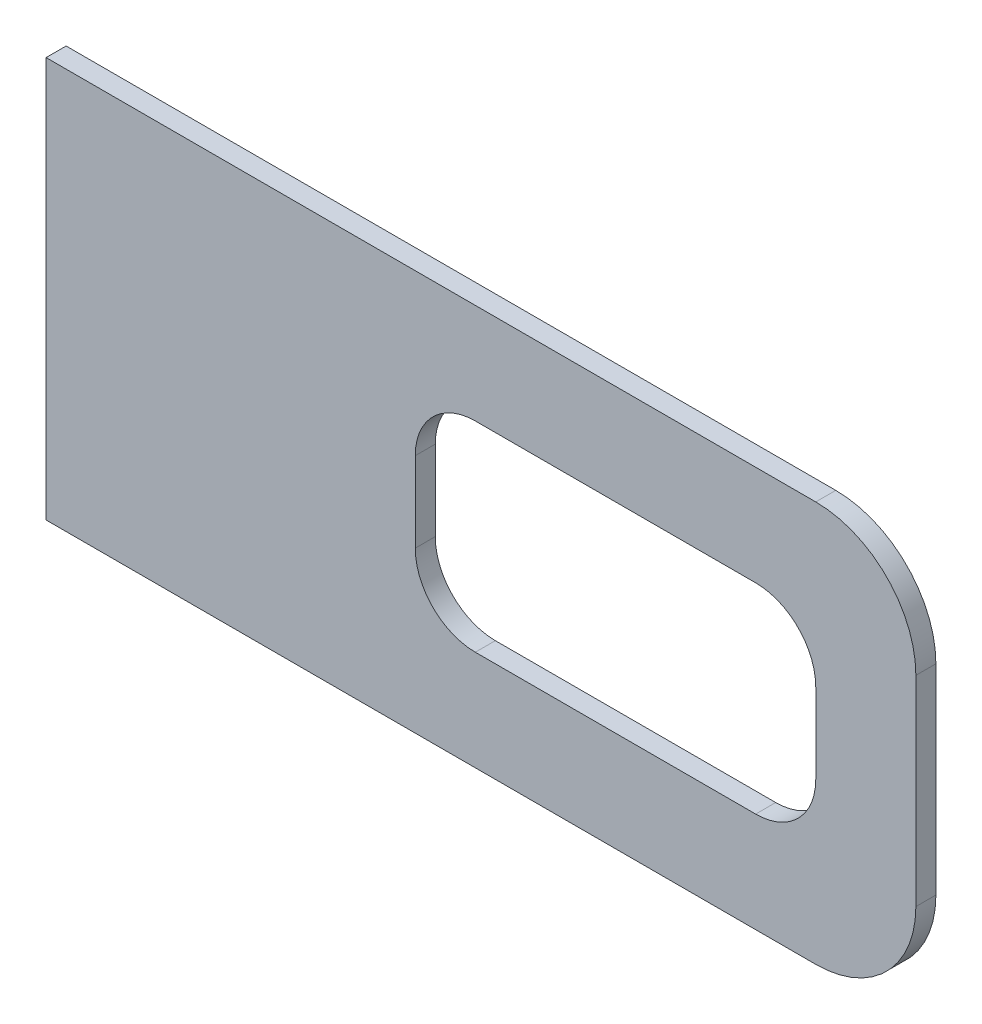
ISO-10303-21;
HEADER;
FILE_DESCRIPTION(('STEP AP214'),'2;1');
FILE_NAME('part.step','',(''),(''),'','','');
FILE_SCHEMA(('AUTOMOTIVE_DESIGN { 1 0 10303 214 1 1 1 1 }'));
ENDSEC;
DATA;
#1=APPLICATION_CONTEXT('core data for automotive mechanical design processes');
#2=APPLICATION_PROTOCOL_DEFINITION('international standard','automotive_design',2000,#1);
#3=PRODUCT_CONTEXT('',#1,'mechanical');
#4=PRODUCT('Part','Part','',(#3));
#5=PRODUCT_RELATED_PRODUCT_CATEGORY('part','',(#4));
#6=PRODUCT_DEFINITION_FORMATION('','',#4);
#7=PRODUCT_DEFINITION_CONTEXT('part definition',#1,'design');
#8=PRODUCT_DEFINITION('design','',#6,#7);
#9=PRODUCT_DEFINITION_SHAPE('','',#8);
#10=(LENGTH_UNIT() NAMED_UNIT(*) SI_UNIT(.MILLI.,.METRE.));
#11=(NAMED_UNIT(*) PLANE_ANGLE_UNIT() SI_UNIT($,.RADIAN.));
#12=(NAMED_UNIT(*) SI_UNIT($,.STERADIAN.) SOLID_ANGLE_UNIT());
#13=UNCERTAINTY_MEASURE_WITH_UNIT(LENGTH_MEASURE(1.E-05),#10,'distance_accuracy_value','');
#14=(GEOMETRIC_REPRESENTATION_CONTEXT(3) GLOBAL_UNCERTAINTY_ASSIGNED_CONTEXT((#13)) GLOBAL_UNIT_ASSIGNED_CONTEXT((#10,
#11,#12)) REPRESENTATION_CONTEXT('',''));
#15=CARTESIAN_POINT('',(0.,0.,0.));
#16=DIRECTION('',(0.,0.,1.));
#17=DIRECTION('',(1.,0.,0.));
#18=AXIS2_PLACEMENT_3D('',#15,#16,#17);
#19=CARTESIAN_POINT('',(5.82825052987823,-48.3092027669727,-17.95));
#20=DIRECTION('',(0.,0.,-1.));
#21=DIRECTION('',(-1.,0.,0.));
#22=AXIS2_PLACEMENT_3D('',#19,#20,#21);
#23=PLANE('',#22);
#24=DIRECTION('',(-1.,0.,0.));
#25=VECTOR('',#24,1.);
#26=CARTESIAN_POINT('',(5.04569769900331,-49.4500000000233,-17.95));
#27=LINE('',#26,#25);
#28=CARTESIAN_POINT('',(3.65650105975645,-49.4500000000274,-17.95));
#29=VERTEX_POINT('',#28);
#30=CARTESIAN_POINT('',(7.5,-49.4500000000233,-17.95));
#31=VERTEX_POINT('',#30);
#32=EDGE_CURVE('E133',#29,#31,#27,.F.);
#33=ORIENTED_EDGE('',*,*,#32,.T.);
#34=CARTESIAN_POINT('',(7.5,-48.9500000000233,-17.95));
#35=DIRECTION('',(0.,0.,-1.));
#36=DIRECTION('',(-1.,0.,0.));
#37=AXIS2_PLACEMENT_3D('',#34,#35,#36);
#38=CIRCLE('',#37,0.5);
#39=CARTESIAN_POINT('',(8.,-48.9500000000233,-17.95));
#40=VERTEX_POINT('',#39);
#41=EDGE_CURVE('E150',#40,#31,#38,.T.);
#42=ORIENTED_EDGE('',*,*,#41,.F.);
#43=DIRECTION('',(0.,-1.,0.));
#44=VECTOR('',#43,1.);
#45=CARTESIAN_POINT('',(8.,-48.2926908880472,-17.95));
#46=LINE('',#45,#44);
#47=CARTESIAN_POINT('',(8.,-47.9500000000233,-17.95));
#48=VERTEX_POINT('',#47);
#49=EDGE_CURVE('E147',#40,#48,#46,.F.);
#50=ORIENTED_EDGE('',*,*,#49,.T.);
#51=CARTESIAN_POINT('',(7.5,-47.9500000000233,-17.95));
#52=DIRECTION('',(0.,0.,-1.));
#53=DIRECTION('',(-1.,0.,0.));
#54=AXIS2_PLACEMENT_3D('',#51,#52,#53);
#55=CIRCLE('',#54,0.5);
#56=CARTESIAN_POINT('',(7.5,-47.4500000000233,-17.95));
#57=VERTEX_POINT('',#56);
#58=EDGE_CURVE('E188',#57,#48,#55,.T.);
#59=ORIENTED_EDGE('',*,*,#58,.F.);
#60=DIRECTION('',(-1.,0.,0.));
#61=VECTOR('',#60,1.);
#62=CARTESIAN_POINT('',(5.04569769900331,-47.4500000000233,-17.95));
#63=LINE('',#62,#61);
#64=CARTESIAN_POINT('',(3.65650105975645,-47.4500000000233,-17.95));
#65=VERTEX_POINT('',#64);
#66=EDGE_CURVE('E143',#65,#57,#63,.F.);
#67=ORIENTED_EDGE('',*,*,#66,.F.);
#68=DIRECTION('',(0.,1.,0.));
#69=VECTOR('',#68,1.);
#70=CARTESIAN_POINT('',(3.65650105975645,-48.2926908880472,-17.95));
#71=LINE('',#70,#69);
#72=EDGE_CURVE('E140',#29,#65,#71,.T.);
#73=ORIENTED_EDGE('',*,*,#72,.F.);
#74=EDGE_LOOP('',(#33,#42,#50,#59,#67,#73));
#75=FACE_BOUND('',#74,.T.);
#76=DIRECTION('',(1.,0.,0.));
#77=VECTOR('',#76,1.);
#78=CARTESIAN_POINT('',(6.36998354457319,-48.9500000000233,-17.95));
#79=LINE('',#78,#77);
#80=CARTESIAN_POINT('',(7.2,-48.9500000000233,-17.95));
#81=VERTEX_POINT('',#80);
#82=CARTESIAN_POINT('',(5.8,-48.9500000000233,-17.95));
#83=VERTEX_POINT('',#82);
#84=EDGE_CURVE('E144',#81,#83,#79,.F.);
#85=ORIENTED_EDGE('',*,*,#84,.T.);
#86=CARTESIAN_POINT('',(5.8,-48.6500000000233,-17.95));
#87=DIRECTION('',(0.,0.,-1.));
#88=DIRECTION('',(-1.,0.,0.));
#89=AXIS2_PLACEMENT_3D('',#86,#87,#88);
#90=CIRCLE('',#89,0.3);
#91=CARTESIAN_POINT('',(5.5,-48.6500000000233,-17.95));
#92=VERTEX_POINT('',#91);
#93=EDGE_CURVE('E191',#83,#92,#90,.T.);
#94=ORIENTED_EDGE('',*,*,#93,.T.);
#95=DIRECTION('',(0.,-1.,0.));
#96=VECTOR('',#95,1.);
#97=CARTESIAN_POINT('',(5.5,-48.4523396372562,-17.95));
#98=LINE('',#97,#96);
#99=CARTESIAN_POINT('',(5.5,-48.2500000000233,-17.95));
#100=VERTEX_POINT('',#99);
#101=EDGE_CURVE('E158',#92,#100,#98,.F.);
#102=ORIENTED_EDGE('',*,*,#101,.T.);
#103=CARTESIAN_POINT('',(5.8,-48.2500000000233,-17.95));
#104=DIRECTION('',(0.,0.,-1.));
#105=DIRECTION('',(-1.,0.,0.));
#106=AXIS2_PLACEMENT_3D('',#103,#104,#105);
#107=CIRCLE('',#106,0.3);
#108=CARTESIAN_POINT('',(5.8,-47.9500000000233,-17.95));
#109=VERTEX_POINT('',#108);
#110=EDGE_CURVE('E195',#100,#109,#107,.T.);
#111=ORIENTED_EDGE('',*,*,#110,.T.);
#112=DIRECTION('',(1.,0.,0.));
#113=VECTOR('',#112,1.);
#114=CARTESIAN_POINT('',(6.36998354457319,-47.9500000000233,-17.95));
#115=LINE('',#114,#113);
#116=CARTESIAN_POINT('',(7.2,-47.9500000000233,-17.95));
#117=VERTEX_POINT('',#116);
#118=EDGE_CURVE('E163',#117,#109,#115,.F.);
#119=ORIENTED_EDGE('',*,*,#118,.F.);
#120=CARTESIAN_POINT('',(7.2,-48.2500000000233,-17.95));
#121=DIRECTION('',(0.,0.,-1.));
#122=DIRECTION('',(-1.,0.,0.));
#123=AXIS2_PLACEMENT_3D('',#120,#121,#122);
#124=CIRCLE('',#123,0.3);
#125=CARTESIAN_POINT('',(7.5,-48.2500000000233,-17.95));
#126=VERTEX_POINT('',#125);
#127=EDGE_CURVE('E112',#117,#126,#124,.T.);
#128=ORIENTED_EDGE('',*,*,#127,.T.);
#129=DIRECTION('',(0.,-1.,0.));
#130=VECTOR('',#129,1.);
#131=CARTESIAN_POINT('',(7.5,-48.3119492054219,-17.95));
#132=LINE('',#131,#130);
#133=CARTESIAN_POINT('',(7.5,-48.6500000000233,-17.95));
#134=VERTEX_POINT('',#133);
#135=EDGE_CURVE('E107',#134,#126,#132,.F.);
#136=ORIENTED_EDGE('',*,*,#135,.F.);
#137=CARTESIAN_POINT('',(7.2,-48.6500000000233,-17.95));
#138=DIRECTION('',(0.,0.,-1.));
#139=DIRECTION('',(-1.,0.,0.));
#140=AXIS2_PLACEMENT_3D('',#137,#138,#139);
#141=CIRCLE('',#140,0.3);
#142=EDGE_CURVE('E19',#134,#81,#141,.T.);
#143=ORIENTED_EDGE('',*,*,#142,.T.);
#144=EDGE_LOOP('',(#85,#94,#102,#111,#119,#128,#136,#143));
#145=FACE_BOUND('',#144,.T.);
#146=ADVANCED_FACE('F16',(#75,#145),#23,.F.);
#147=CARTESIAN_POINT('',(7.2,-48.6500000000233,-18.05));
#148=DIRECTION('',(0.,0.,-1.));
#149=DIRECTION('',(-1.,0.,0.));
#150=AXIS2_PLACEMENT_3D('',#147,#148,#149);
#151=CYLINDRICAL_SURFACE('',#150,0.3);
#152=DIRECTION('',(0.,0.,1.));
#153=VECTOR('',#152,1.);
#154=CARTESIAN_POINT('',(7.5,-48.6500000000233,-18.05));
#155=LINE('',#154,#153);
#156=CARTESIAN_POINT('',(7.5,-48.6500000000233,-18.05));
#157=VERTEX_POINT('',#156);
#158=EDGE_CURVE('E116',#157,#134,#155,.T.);
#159=ORIENTED_EDGE('',*,*,#158,.F.);
#160=CARTESIAN_POINT('',(7.2,-48.6500000000233,-18.05));
#161=DIRECTION('',(0.,0.,-1.));
#162=DIRECTION('',(-1.,0.,0.));
#163=AXIS2_PLACEMENT_3D('',#160,#161,#162);
#164=CIRCLE('',#163,0.3);
#165=CARTESIAN_POINT('',(7.2,-48.9500000000233,-18.05));
#166=VERTEX_POINT('',#165);
#167=EDGE_CURVE('E136',#166,#157,#164,.F.);
#168=ORIENTED_EDGE('',*,*,#167,.F.);
#169=DIRECTION('',(0.,0.,1.));
#170=VECTOR('',#169,1.);
#171=CARTESIAN_POINT('',(7.2,-48.9500000000233,-18.05));
#172=LINE('',#171,#170);
#173=EDGE_CURVE('E122',#166,#81,#172,.T.);
#174=ORIENTED_EDGE('',*,*,#173,.T.);
#175=ORIENTED_EDGE('',*,*,#142,.F.);
#176=EDGE_LOOP('',(#159,#168,#174,#175));
#177=FACE_BOUND('',#176,.T.);
#178=ADVANCED_FACE('F119',(#177),#151,.F.);
#179=CARTESIAN_POINT('',(7.5,-48.3119492054219,-18.05));
#180=DIRECTION('',(-1.,0.,0.));
#181=DIRECTION('',(0.,-1.,0.));
#182=AXIS2_PLACEMENT_3D('',#179,#180,#181);
#183=PLANE('',#182);
#184=DIRECTION('',(0.,1.,0.));
#185=VECTOR('',#184,1.);
#186=CARTESIAN_POINT('',(7.5,-48.3092027669727,-18.05));
#187=LINE('',#186,#185);
#188=CARTESIAN_POINT('',(7.5,-48.2500000000233,-18.05));
#189=VERTEX_POINT('',#188);
#190=EDGE_CURVE('E126',#157,#189,#187,.T.);
#191=ORIENTED_EDGE('',*,*,#190,.F.);
#192=ORIENTED_EDGE('',*,*,#158,.T.);
#193=ORIENTED_EDGE('',*,*,#135,.T.);
#194=DIRECTION('',(0.,0.,-1.));
#195=VECTOR('',#194,1.);
#196=CARTESIAN_POINT('',(7.5,-48.2500000000233,-18.05));
#197=LINE('',#196,#195);
#198=EDGE_CURVE('E128',#126,#189,#197,.T.);
#199=ORIENTED_EDGE('',*,*,#198,.T.);
#200=EDGE_LOOP('',(#191,#192,#193,#199));
#201=FACE_BOUND('',#200,.T.);
#202=ADVANCED_FACE('F124',(#201),#183,.T.);
#203=CARTESIAN_POINT('',(7.2,-48.2500000000233,-18.05));
#204=DIRECTION('',(0.,0.,-1.));
#205=DIRECTION('',(-1.,0.,0.));
#206=AXIS2_PLACEMENT_3D('',#203,#204,#205);
#207=CYLINDRICAL_SURFACE('',#206,0.3);
#208=DIRECTION('',(0.,0.,1.));
#209=VECTOR('',#208,1.);
#210=CARTESIAN_POINT('',(7.2,-47.9500000000233,-18.05));
#211=LINE('',#210,#209);
#212=CARTESIAN_POINT('',(7.2,-47.9500000000233,-18.05));
#213=VERTEX_POINT('',#212);
#214=EDGE_CURVE('E164',#213,#117,#211,.T.);
#215=ORIENTED_EDGE('',*,*,#214,.F.);
#216=CARTESIAN_POINT('',(7.2,-48.2500000000233,-18.05));
#217=DIRECTION('',(0.,0.,-1.));
#218=DIRECTION('',(-1.,0.,0.));
#219=AXIS2_PLACEMENT_3D('',#216,#217,#218);
#220=CIRCLE('',#219,0.3);
#221=EDGE_CURVE('E182',#189,#213,#220,.F.);
#222=ORIENTED_EDGE('',*,*,#221,.F.);
#223=ORIENTED_EDGE('',*,*,#198,.F.);
#224=ORIENTED_EDGE('',*,*,#127,.F.);
#225=EDGE_LOOP('',(#215,#222,#223,#224));
#226=FACE_BOUND('',#225,.T.);
#227=ADVANCED_FACE('F366',(#226),#207,.F.);
#228=CARTESIAN_POINT('',(6.36998354457319,-47.9500000000233,-18.05));
#229=DIRECTION('',(0.,-1.,0.));
#230=DIRECTION('',(1.,0.,0.));
#231=AXIS2_PLACEMENT_3D('',#228,#229,#230);
#232=PLANE('',#231);
#233=DIRECTION('',(-1.,0.,0.));
#234=VECTOR('',#233,1.);
#235=CARTESIAN_POINT('',(5.82825052987823,-47.9500000000233,-18.05));
#236=LINE('',#235,#234);
#237=CARTESIAN_POINT('',(5.8,-47.9500000000233,-18.05));
#238=VERTEX_POINT('',#237);
#239=EDGE_CURVE('E181',#213,#238,#236,.T.);
#240=ORIENTED_EDGE('',*,*,#239,.F.);
#241=ORIENTED_EDGE('',*,*,#214,.T.);
#242=ORIENTED_EDGE('',*,*,#118,.T.);
#243=DIRECTION('',(0.,0.,-1.));
#244=VECTOR('',#243,1.);
#245=CARTESIAN_POINT('',(5.8,-47.9500000000233,-18.05));
#246=LINE('',#245,#244);
#247=EDGE_CURVE('E197',#109,#238,#246,.T.);
#248=ORIENTED_EDGE('',*,*,#247,.T.);
#249=EDGE_LOOP('',(#240,#241,#242,#248));
#250=FACE_BOUND('',#249,.T.);
#251=ADVANCED_FACE('F356',(#250),#232,.T.);
#252=CARTESIAN_POINT('',(5.8,-48.2500000000233,-18.05));
#253=DIRECTION('',(0.,0.,-1.));
#254=DIRECTION('',(-1.,0.,0.));
#255=AXIS2_PLACEMENT_3D('',#252,#253,#254);
#256=CYLINDRICAL_SURFACE('',#255,0.3);
#257=DIRECTION('',(0.,0.,1.));
#258=VECTOR('',#257,1.);
#259=CARTESIAN_POINT('',(5.5,-48.2500000000233,-18.05));
#260=LINE('',#259,#258);
#261=CARTESIAN_POINT('',(5.5,-48.2500000000233,-18.05));
#262=VERTEX_POINT('',#261);
#263=EDGE_CURVE('E162',#100,#262,#260,.F.);
#264=ORIENTED_EDGE('',*,*,#263,.T.);
#265=CARTESIAN_POINT('',(5.8,-48.2500000000233,-18.05));
#266=DIRECTION('',(0.,0.,-1.));
#267=DIRECTION('',(-1.,0.,0.));
#268=AXIS2_PLACEMENT_3D('',#265,#266,#267);
#269=CIRCLE('',#268,0.3);
#270=EDGE_CURVE('E178',#238,#262,#269,.F.);
#271=ORIENTED_EDGE('',*,*,#270,.F.);
#272=ORIENTED_EDGE('',*,*,#247,.F.);
#273=ORIENTED_EDGE('',*,*,#110,.F.);
#274=EDGE_LOOP('',(#264,#271,#272,#273));
#275=FACE_BOUND('',#274,.T.);
#276=ADVANCED_FACE('F346',(#275),#256,.F.);
#277=CARTESIAN_POINT('',(5.5,-48.4523396372562,-18.05));
#278=DIRECTION('',(-1.,0.,0.));
#279=DIRECTION('',(0.,-1.,0.));
#280=AXIS2_PLACEMENT_3D('',#277,#278,#279);
#281=PLANE('',#280);
#282=DIRECTION('',(0.,0.,-1.));
#283=VECTOR('',#282,1.);
#284=CARTESIAN_POINT('',(5.5,-48.6500000000233,-18.05));
#285=LINE('',#284,#283);
#286=CARTESIAN_POINT('',(5.5,-48.6500000000233,-18.05));
#287=VERTEX_POINT('',#286);
#288=EDGE_CURVE('E161',#92,#287,#285,.T.);
#289=ORIENTED_EDGE('',*,*,#288,.T.);
#290=DIRECTION('',(0.,1.,0.));
#291=VECTOR('',#290,1.);
#292=CARTESIAN_POINT('',(5.5,-48.3092027669727,-18.05));
#293=LINE('',#292,#291);
#294=EDGE_CURVE('E177',#262,#287,#293,.F.);
#295=ORIENTED_EDGE('',*,*,#294,.F.);
#296=ORIENTED_EDGE('',*,*,#263,.F.);
#297=ORIENTED_EDGE('',*,*,#101,.F.);
#298=EDGE_LOOP('',(#289,#295,#296,#297));
#299=FACE_BOUND('',#298,.T.);
#300=ADVANCED_FACE('F336',(#299),#281,.F.);
#301=CARTESIAN_POINT('',(5.8,-48.6500000000233,-18.05));
#302=DIRECTION('',(0.,0.,-1.));
#303=DIRECTION('',(-1.,0.,0.));
#304=AXIS2_PLACEMENT_3D('',#301,#302,#303);
#305=CYLINDRICAL_SURFACE('',#304,0.3);
#306=DIRECTION('',(0.,0.,1.));
#307=VECTOR('',#306,1.);
#308=CARTESIAN_POINT('',(5.8,-48.9500000000233,-18.05));
#309=LINE('',#308,#307);
#310=CARTESIAN_POINT('',(5.8,-48.9500000000233,-18.05));
#311=VERTEX_POINT('',#310);
#312=EDGE_CURVE('E194',#83,#311,#309,.F.);
#313=ORIENTED_EDGE('',*,*,#312,.T.);
#314=CARTESIAN_POINT('',(5.8,-48.6500000000233,-18.05));
#315=DIRECTION('',(0.,0.,-1.));
#316=DIRECTION('',(-1.,0.,0.));
#317=AXIS2_PLACEMENT_3D('',#314,#315,#316);
#318=CIRCLE('',#317,0.3);
#319=EDGE_CURVE('E173',#287,#311,#318,.F.);
#320=ORIENTED_EDGE('',*,*,#319,.F.);
#321=ORIENTED_EDGE('',*,*,#288,.F.);
#322=ORIENTED_EDGE('',*,*,#93,.F.);
#323=EDGE_LOOP('',(#313,#320,#321,#322));
#324=FACE_BOUND('',#323,.T.);
#325=ADVANCED_FACE('F326',(#324),#305,.F.);
#326=CARTESIAN_POINT('',(6.36998354457319,-48.9500000000233,-18.05));
#327=DIRECTION('',(0.,-1.,0.));
#328=DIRECTION('',(1.,0.,0.));
#329=AXIS2_PLACEMENT_3D('',#326,#327,#328);
#330=PLANE('',#329);
#331=ORIENTED_EDGE('',*,*,#173,.F.);
#332=DIRECTION('',(-1.,0.,0.));
#333=VECTOR('',#332,1.);
#334=CARTESIAN_POINT('',(5.82825052987823,-48.9500000000233,-18.05));
#335=LINE('',#334,#333);
#336=EDGE_CURVE('E176',#311,#166,#335,.F.);
#337=ORIENTED_EDGE('',*,*,#336,.F.);
#338=ORIENTED_EDGE('',*,*,#312,.F.);
#339=ORIENTED_EDGE('',*,*,#84,.F.);
#340=EDGE_LOOP('',(#331,#337,#338,#339));
#341=FACE_BOUND('',#340,.T.);
#342=ADVANCED_FACE('F316',(#341),#330,.F.);
#343=CARTESIAN_POINT('',(3.65650105975645,-48.2926908880472,-18.05));
#344=DIRECTION('',(-1.,0.,0.));
#345=DIRECTION('',(0.,0.,1.));
#346=AXIS2_PLACEMENT_3D('',#343,#344,#345);
#347=PLANE('',#346);
#348=DIRECTION('',(0.,1.,0.));
#349=VECTOR('',#348,1.);
#350=CARTESIAN_POINT('',(3.65650105975645,-48.3092027669727,-18.05));
#351=LINE('',#350,#349);
#352=CARTESIAN_POINT('',(3.65650105975645,-49.4500000000233,-18.05));
#353=VERTEX_POINT('',#352);
#354=CARTESIAN_POINT('',(3.65650105975645,-47.4500000000233,-18.05));
#355=VERTEX_POINT('',#354);
#356=EDGE_CURVE('E220',#353,#355,#351,.T.);
#357=ORIENTED_EDGE('',*,*,#356,.F.);
#358=DIRECTION('',(0.,0.,1.));
#359=VECTOR('',#358,1.);
#360=CARTESIAN_POINT('',(3.65650105975645,-49.4500000000233,-18.05));
#361=LINE('',#360,#359);
#362=EDGE_CURVE('E137',#353,#29,#361,.T.);
#363=ORIENTED_EDGE('',*,*,#362,.T.);
#364=ORIENTED_EDGE('',*,*,#72,.T.);
#365=DIRECTION('',(0.,0.,1.));
#366=VECTOR('',#365,1.);
#367=CARTESIAN_POINT('',(3.65650105975645,-47.4500000000233,-18.05));
#368=LINE('',#367,#366);
#369=EDGE_CURVE('E154',#355,#65,#368,.T.);
#370=ORIENTED_EDGE('',*,*,#369,.F.);
#371=EDGE_LOOP('',(#357,#363,#364,#370));
#372=FACE_BOUND('',#371,.T.);
#373=ADVANCED_FACE('F306',(#372),#347,.T.);
#374=CARTESIAN_POINT('',(5.04569769900331,-47.4500000000233,-18.05));
#375=DIRECTION('',(0.,1.,0.));
#376=DIRECTION('',(-1.,0.,0.));
#377=AXIS2_PLACEMENT_3D('',#374,#375,#376);
#378=PLANE('',#377);
#379=DIRECTION('',(-1.,0.,0.));
#380=VECTOR('',#379,1.);
#381=CARTESIAN_POINT('',(5.82825052987823,-47.4500000000233,-18.05));
#382=LINE('',#381,#380);
#383=CARTESIAN_POINT('',(7.5,-47.4500000000233,-18.05));
#384=VERTEX_POINT('',#383);
#385=EDGE_CURVE('E172',#355,#384,#382,.F.);
#386=ORIENTED_EDGE('',*,*,#385,.F.);
#387=ORIENTED_EDGE('',*,*,#369,.T.);
#388=ORIENTED_EDGE('',*,*,#66,.T.);
#389=DIRECTION('',(0.,0.,-1.));
#390=VECTOR('',#389,1.);
#391=CARTESIAN_POINT('',(7.5,-47.4500000000233,-18.05));
#392=LINE('',#391,#390);
#393=EDGE_CURVE('E190',#384,#57,#392,.F.);
#394=ORIENTED_EDGE('',*,*,#393,.F.);
#395=EDGE_LOOP('',(#386,#387,#388,#394));
#396=FACE_BOUND('',#395,.T.);
#397=ADVANCED_FACE('F296',(#396),#378,.T.);
#398=CARTESIAN_POINT('',(7.5,-47.9500000000233,-18.05));
#399=DIRECTION('',(0.,0.,-1.));
#400=DIRECTION('',(-1.,0.,0.));
#401=AXIS2_PLACEMENT_3D('',#398,#399,#400);
#402=CYLINDRICAL_SURFACE('',#401,0.5);
#403=CARTESIAN_POINT('',(7.5,-47.9500000000233,-18.05));
#404=DIRECTION('',(0.,0.,-1.));
#405=DIRECTION('',(-1.,0.,0.));
#406=AXIS2_PLACEMENT_3D('',#403,#404,#405);
#407=CIRCLE('',#406,0.5);
#408=CARTESIAN_POINT('',(8.,-47.9500000000233,-18.05));
#409=VERTEX_POINT('',#408);
#410=EDGE_CURVE('E169',#384,#409,#407,.T.);
#411=ORIENTED_EDGE('',*,*,#410,.F.);
#412=ORIENTED_EDGE('',*,*,#393,.T.);
#413=ORIENTED_EDGE('',*,*,#58,.T.);
#414=DIRECTION('',(0.,0.,1.));
#415=VECTOR('',#414,1.);
#416=CARTESIAN_POINT('',(8.,-47.9500000000233,-18.05));
#417=LINE('',#416,#415);
#418=EDGE_CURVE('E151',#48,#409,#417,.F.);
#419=ORIENTED_EDGE('',*,*,#418,.T.);
#420=EDGE_LOOP('',(#411,#412,#413,#419));
#421=FACE_BOUND('',#420,.T.);
#422=ADVANCED_FACE('F262',(#421),#402,.T.);
#423=CARTESIAN_POINT('',(8.,-48.2926908880472,-18.05));
#424=DIRECTION('',(-1.,0.,0.));
#425=DIRECTION('',(0.,-1.,0.));
#426=AXIS2_PLACEMENT_3D('',#423,#424,#425);
#427=PLANE('',#426);
#428=DIRECTION('',(0.,0.,-1.));
#429=VECTOR('',#428,1.);
#430=CARTESIAN_POINT('',(8.,-48.9500000000233,-18.05));
#431=LINE('',#430,#429);
#432=CARTESIAN_POINT('',(8.,-48.9500000000233,-18.05));
#433=VERTEX_POINT('',#432);
#434=EDGE_CURVE('E187',#433,#40,#431,.F.);
#435=ORIENTED_EDGE('',*,*,#434,.F.);
#436=DIRECTION('',(0.,1.,0.));
#437=VECTOR('',#436,1.);
#438=CARTESIAN_POINT('',(8.,-48.3092027669727,-18.05));
#439=LINE('',#438,#437);
#440=EDGE_CURVE('E168',#409,#433,#439,.F.);
#441=ORIENTED_EDGE('',*,*,#440,.F.);
#442=ORIENTED_EDGE('',*,*,#418,.F.);
#443=ORIENTED_EDGE('',*,*,#49,.F.);
#444=EDGE_LOOP('',(#435,#441,#442,#443));
#445=FACE_BOUND('',#444,.T.);
#446=ADVANCED_FACE('F249',(#445),#427,.F.);
#447=CARTESIAN_POINT('',(7.5,-48.9500000000233,-18.05));
#448=DIRECTION('',(0.,0.,-1.));
#449=DIRECTION('',(-1.,0.,0.));
#450=AXIS2_PLACEMENT_3D('',#447,#448,#449);
#451=CYLINDRICAL_SURFACE('',#450,0.5);
#452=CARTESIAN_POINT('',(7.5,-48.9500000000233,-18.05));
#453=DIRECTION('',(0.,0.,-1.));
#454=DIRECTION('',(-1.,0.,0.));
#455=AXIS2_PLACEMENT_3D('',#452,#453,#454);
#456=CIRCLE('',#455,0.5);
#457=CARTESIAN_POINT('',(7.5,-49.4500000000233,-18.05));
#458=VERTEX_POINT('',#457);
#459=EDGE_CURVE('E25',#433,#458,#456,.T.);
#460=ORIENTED_EDGE('',*,*,#459,.F.);
#461=ORIENTED_EDGE('',*,*,#434,.T.);
#462=ORIENTED_EDGE('',*,*,#41,.T.);
#463=DIRECTION('',(0.,0.,1.));
#464=VECTOR('',#463,1.);
#465=CARTESIAN_POINT('',(7.5,-49.4500000000233,-18.05));
#466=LINE('',#465,#464);
#467=EDGE_CURVE('E34',#31,#458,#466,.F.);
#468=ORIENTED_EDGE('',*,*,#467,.T.);
#469=EDGE_LOOP('',(#460,#461,#462,#468));
#470=FACE_BOUND('',#469,.T.);
#471=ADVANCED_FACE('F251',(#470),#451,.T.);
#472=CARTESIAN_POINT('',(5.04569769900331,-49.4500000000233,-18.05));
#473=DIRECTION('',(0.,1.,0.));
#474=DIRECTION('',(-1.,0.,0.));
#475=AXIS2_PLACEMENT_3D('',#472,#473,#474);
#476=PLANE('',#475);
#477=ORIENTED_EDGE('',*,*,#362,.F.);
#478=DIRECTION('',(-1.,0.,0.));
#479=VECTOR('',#478,1.);
#480=CARTESIAN_POINT('',(5.82825052987823,-49.4500000000233,-18.05));
#481=LINE('',#480,#479);
#482=EDGE_CURVE('E11',#458,#353,#481,.T.);
#483=ORIENTED_EDGE('',*,*,#482,.F.);
#484=ORIENTED_EDGE('',*,*,#467,.F.);
#485=ORIENTED_EDGE('',*,*,#32,.F.);
#486=EDGE_LOOP('',(#477,#483,#484,#485));
#487=FACE_BOUND('',#486,.T.);
#488=ADVANCED_FACE('F253',(#487),#476,.F.);
#489=CARTESIAN_POINT('',(5.82825052987823,-48.3092027669727,-18.05));
#490=DIRECTION('',(0.,0.,-1.));
#491=DIRECTION('',(-1.,0.,0.));
#492=AXIS2_PLACEMENT_3D('',#489,#490,#491);
#493=PLANE('',#492);
#494=ORIENTED_EDGE('',*,*,#459,.T.);
#495=ORIENTED_EDGE('',*,*,#482,.T.);
#496=ORIENTED_EDGE('',*,*,#356,.T.);
#497=ORIENTED_EDGE('',*,*,#385,.T.);
#498=ORIENTED_EDGE('',*,*,#410,.T.);
#499=ORIENTED_EDGE('',*,*,#440,.T.);
#500=EDGE_LOOP('',(#494,#495,#496,#497,#498,#499));
#501=FACE_BOUND('',#500,.T.);
#502=ORIENTED_EDGE('',*,*,#319,.T.);
#503=ORIENTED_EDGE('',*,*,#336,.T.);
#504=ORIENTED_EDGE('',*,*,#167,.T.);
#505=ORIENTED_EDGE('',*,*,#190,.T.);
#506=ORIENTED_EDGE('',*,*,#221,.T.);
#507=ORIENTED_EDGE('',*,*,#239,.T.);
#508=ORIENTED_EDGE('',*,*,#270,.T.);
#509=ORIENTED_EDGE('',*,*,#294,.T.);
#510=EDGE_LOOP('',(#502,#503,#504,#505,#506,#507,#508,#509));
#511=FACE_BOUND('',#510,.T.);
#512=ADVANCED_FACE('F244',(#501,#511),#493,.T.);
#513=CLOSED_SHELL('',(#146,#178,#202,#227,#251,#276,#300,#325,#342,#373,#397,#422,#446,#471,
#488,#512));
#514=MANIFOLD_SOLID_BREP('B1',#513);
#515=ADVANCED_BREP_SHAPE_REPRESENTATION('',(#18,#514),#14);
#516=SHAPE_DEFINITION_REPRESENTATION(#9,#515);
ENDSEC;
END-ISO-10303-21;
